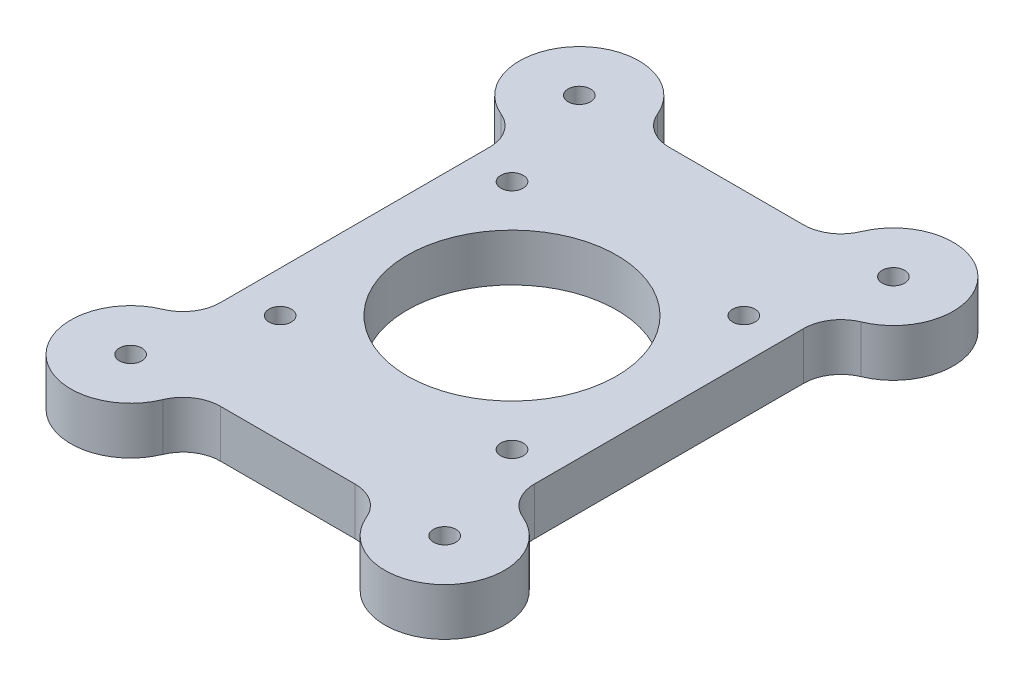
ISO-10303-21;
HEADER;
FILE_DESCRIPTION(('STEP AP214'),'2;1');
FILE_NAME('part.step','',(''),(''),'','','');
FILE_SCHEMA(('AUTOMOTIVE_DESIGN { 1 0 10303 214 1 1 1 1 }'));
ENDSEC;
DATA;
#1=APPLICATION_CONTEXT('core data for automotive mechanical design processes');
#2=APPLICATION_PROTOCOL_DEFINITION('international standard','automotive_design',2000,#1);
#3=PRODUCT_CONTEXT('',#1,'mechanical');
#4=PRODUCT('Part','Part','',(#3));
#5=PRODUCT_RELATED_PRODUCT_CATEGORY('part','',(#4));
#6=PRODUCT_DEFINITION_FORMATION('','',#4);
#7=PRODUCT_DEFINITION_CONTEXT('part definition',#1,'design');
#8=PRODUCT_DEFINITION('design','',#6,#7);
#9=PRODUCT_DEFINITION_SHAPE('','',#8);
#10=(LENGTH_UNIT() NAMED_UNIT(*) SI_UNIT(.MILLI.,.METRE.));
#11=(NAMED_UNIT(*) PLANE_ANGLE_UNIT() SI_UNIT($,.RADIAN.));
#12=(NAMED_UNIT(*) SI_UNIT($,.STERADIAN.) SOLID_ANGLE_UNIT());
#13=UNCERTAINTY_MEASURE_WITH_UNIT(LENGTH_MEASURE(1.E-05),#10,'distance_accuracy_value','');
#14=(GEOMETRIC_REPRESENTATION_CONTEXT(3) GLOBAL_UNCERTAINTY_ASSIGNED_CONTEXT((#13)) GLOBAL_UNIT_ASSIGNED_CONTEXT((#10,
#11,#12)) REPRESENTATION_CONTEXT('',''));
#15=CARTESIAN_POINT('',(0.,0.,0.));
#16=DIRECTION('',(0.,0.,1.));
#17=DIRECTION('',(1.,0.,0.));
#18=AXIS2_PLACEMENT_3D('',#15,#16,#17);
#19=CARTESIAN_POINT('',(21.,6.35,30.));
#20=DIRECTION('',(0.,-1.,0.));
#21=DIRECTION('',(0.,0.,-1.));
#22=AXIS2_PLACEMENT_3D('',#19,#20,#21);
#23=CYLINDRICAL_SURFACE('',#22,8.);
#24=CARTESIAN_POINT('',(21.,0.,30.));
#25=DIRECTION('',(0.,1.,0.));
#26=DIRECTION('',(0.,0.,1.));
#27=AXIS2_PLACEMENT_3D('',#24,#25,#26);
#28=CIRCLE('',#27,8.);
#29=CARTESIAN_POINT('',(13.6153846153846,0.,33.0769230769231));
#30=VERTEX_POINT('',#29);
#31=CARTESIAN_POINT('',(24.0769230769231,0.,22.6153846153846));
#32=VERTEX_POINT('',#31);
#33=EDGE_CURVE('E185',#30,#32,#28,.T.);
#34=ORIENTED_EDGE('',*,*,#33,.T.);
#35=DIRECTION('',(0.,-1.,0.));
#36=VECTOR('',#35,1.);
#37=CARTESIAN_POINT('',(24.0769230769231,6.35,22.6153846153846));
#38=LINE('',#37,#36);
#39=CARTESIAN_POINT('',(24.0769230769231,6.35,22.6153846153846));
#40=VERTEX_POINT('',#39);
#41=EDGE_CURVE('E160',#32,#40,#38,.F.);
#42=ORIENTED_EDGE('',*,*,#41,.T.);
#43=CARTESIAN_POINT('',(21.,6.35,30.));
#44=DIRECTION('',(0.,1.,0.));
#45=DIRECTION('',(0.,0.,1.));
#46=AXIS2_PLACEMENT_3D('',#43,#44,#45);
#47=CIRCLE('',#46,8.);
#48=CARTESIAN_POINT('',(13.6153846153846,6.35,33.0769230769231));
#49=VERTEX_POINT('',#48);
#50=EDGE_CURVE('E215',#49,#40,#47,.T.);
#51=ORIENTED_EDGE('',*,*,#50,.F.);
#52=DIRECTION('',(0.,-1.,0.));
#53=VECTOR('',#52,1.);
#54=CARTESIAN_POINT('',(13.6153846153846,6.35,33.0769230769231));
#55=LINE('',#54,#53);
#56=EDGE_CURVE('E177',#49,#30,#55,.T.);
#57=ORIENTED_EDGE('',*,*,#56,.T.);
#58=EDGE_LOOP('',(#34,#42,#51,#57));
#59=FACE_BOUND('',#58,.T.);
#60=ADVANCED_FACE('F41',(#59),#23,.T.);
#61=CARTESIAN_POINT('',(21.,6.35,0.));
#62=DIRECTION('',(-1.,0.,0.));
#63=DIRECTION('',(0.,0.,1.));
#64=AXIS2_PLACEMENT_3D('',#61,#62,#63);
#65=PLANE('',#64);
#66=DIRECTION('',(0.,0.,-1.));
#67=VECTOR('',#66,1.);
#68=CARTESIAN_POINT('',(21.,6.35,0.));
#69=LINE('',#68,#67);
#70=CARTESIAN_POINT('',(21.,6.35,18.));
#71=VERTEX_POINT('',#70);
#72=CARTESIAN_POINT('',(21.,6.35,-18.));
#73=VERTEX_POINT('',#72);
#74=EDGE_CURVE('E175',#71,#73,#69,.T.);
#75=ORIENTED_EDGE('',*,*,#74,.F.);
#76=DIRECTION('',(0.,1.,0.));
#77=VECTOR('',#76,1.);
#78=CARTESIAN_POINT('',(21.,0.,18.));
#79=LINE('',#78,#77);
#80=CARTESIAN_POINT('',(21.,0.,18.));
#81=VERTEX_POINT('',#80);
#82=EDGE_CURVE('E159',#71,#81,#79,.F.);
#83=ORIENTED_EDGE('',*,*,#82,.T.);
#84=DIRECTION('',(0.,0.,-1.));
#85=VECTOR('',#84,1.);
#86=CARTESIAN_POINT('',(21.,0.,0.));
#87=LINE('',#86,#85);
#88=CARTESIAN_POINT('',(21.,0.,-18.));
#89=VERTEX_POINT('',#88);
#90=EDGE_CURVE('E172',#81,#89,#87,.T.);
#91=ORIENTED_EDGE('',*,*,#90,.T.);
#92=DIRECTION('',(0.,1.,0.));
#93=VECTOR('',#92,1.);
#94=CARTESIAN_POINT('',(21.,6.35,-18.));
#95=LINE('',#94,#93);
#96=EDGE_CURVE('E178',#89,#73,#95,.T.);
#97=ORIENTED_EDGE('',*,*,#96,.T.);
#98=EDGE_LOOP('',(#75,#83,#91,#97));
#99=FACE_BOUND('',#98,.T.);
#100=ADVANCED_FACE('F171',(#99),#65,.F.);
#101=CARTESIAN_POINT('',(21.,6.35,-30.));
#102=DIRECTION('',(0.,-1.,0.));
#103=DIRECTION('',(0.,0.,-1.));
#104=AXIS2_PLACEMENT_3D('',#101,#102,#103);
#105=CYLINDRICAL_SURFACE('',#104,8.);
#106=CARTESIAN_POINT('',(21.,6.35,-30.));
#107=DIRECTION('',(0.,1.,0.));
#108=DIRECTION('',(0.,0.,1.));
#109=AXIS2_PLACEMENT_3D('',#106,#107,#108);
#110=CIRCLE('',#109,8.);
#111=CARTESIAN_POINT('',(24.0769230769231,6.35,-22.6153846153846));
#112=VERTEX_POINT('',#111);
#113=CARTESIAN_POINT('',(13.6153846153846,6.35,-33.0769230769231));
#114=VERTEX_POINT('',#113);
#115=EDGE_CURVE('E329',#112,#114,#110,.T.);
#116=ORIENTED_EDGE('',*,*,#115,.F.);
#117=DIRECTION('',(0.,-1.,0.));
#118=VECTOR('',#117,1.);
#119=CARTESIAN_POINT('',(24.0769230769231,6.35,-22.6153846153846));
#120=LINE('',#119,#118);
#121=CARTESIAN_POINT('',(24.0769230769231,0.,-22.6153846153846));
#122=VERTEX_POINT('',#121);
#123=EDGE_CURVE('E227',#112,#122,#120,.T.);
#124=ORIENTED_EDGE('',*,*,#123,.T.);
#125=CARTESIAN_POINT('',(21.,0.,-30.));
#126=DIRECTION('',(0.,1.,0.));
#127=DIRECTION('',(0.,0.,1.));
#128=AXIS2_PLACEMENT_3D('',#125,#126,#127);
#129=CIRCLE('',#128,8.);
#130=CARTESIAN_POINT('',(13.6153846153846,0.,-33.0769230769231));
#131=VERTEX_POINT('',#130);
#132=EDGE_CURVE('E184',#122,#131,#129,.T.);
#133=ORIENTED_EDGE('',*,*,#132,.T.);
#134=DIRECTION('',(0.,-1.,0.));
#135=VECTOR('',#134,1.);
#136=CARTESIAN_POINT('',(13.6153846153846,6.35,-33.0769230769231));
#137=LINE('',#136,#135);
#138=EDGE_CURVE('E224',#131,#114,#137,.F.);
#139=ORIENTED_EDGE('',*,*,#138,.T.);
#140=EDGE_LOOP('',(#116,#124,#133,#139));
#141=FACE_BOUND('',#140,.T.);
#142=ADVANCED_FACE('F459',(#141),#105,.T.);
#143=CARTESIAN_POINT('',(0.,6.35,-30.));
#144=DIRECTION('',(0.,0.,1.));
#145=DIRECTION('',(1.,0.,0.));
#146=AXIS2_PLACEMENT_3D('',#143,#144,#145);
#147=PLANE('',#146);
#148=DIRECTION('',(-1.,0.,0.));
#149=VECTOR('',#148,1.);
#150=CARTESIAN_POINT('',(0.,0.,-30.));
#151=LINE('',#150,#149);
#152=CARTESIAN_POINT('',(9.00000000000001,0.,-30.));
#153=VERTEX_POINT('',#152);
#154=CARTESIAN_POINT('',(-9.,0.,-30.));
#155=VERTEX_POINT('',#154);
#156=EDGE_CURVE('E190',#153,#155,#151,.T.);
#157=ORIENTED_EDGE('',*,*,#156,.T.);
#158=DIRECTION('',(0.,1.,0.));
#159=VECTOR('',#158,1.);
#160=CARTESIAN_POINT('',(-9.,6.35,-30.));
#161=LINE('',#160,#159);
#162=CARTESIAN_POINT('',(-9.,6.35,-30.));
#163=VERTEX_POINT('',#162);
#164=EDGE_CURVE('E242',#155,#163,#161,.T.);
#165=ORIENTED_EDGE('',*,*,#164,.T.);
#166=DIRECTION('',(-1.,0.,0.));
#167=VECTOR('',#166,1.);
#168=CARTESIAN_POINT('',(0.,6.35,-30.));
#169=LINE('',#168,#167);
#170=CARTESIAN_POINT('',(9.00000000000001,6.35,-30.));
#171=VERTEX_POINT('',#170);
#172=EDGE_CURVE('E325',#171,#163,#169,.T.);
#173=ORIENTED_EDGE('',*,*,#172,.F.);
#174=DIRECTION('',(0.,1.,0.));
#175=VECTOR('',#174,1.);
#176=CARTESIAN_POINT('',(9.00000000000001,0.,-30.));
#177=LINE('',#176,#175);
#178=EDGE_CURVE('E238',#171,#153,#177,.F.);
#179=ORIENTED_EDGE('',*,*,#178,.T.);
#180=EDGE_LOOP('',(#157,#165,#173,#179));
#181=FACE_BOUND('',#180,.T.);
#182=ADVANCED_FACE('F503',(#181),#147,.F.);
#183=CARTESIAN_POINT('',(-21.,6.35,-30.));
#184=DIRECTION('',(0.,-1.,0.));
#185=DIRECTION('',(0.,0.,-1.));
#186=AXIS2_PLACEMENT_3D('',#183,#184,#185);
#187=CYLINDRICAL_SURFACE('',#186,8.);
#188=CARTESIAN_POINT('',(-21.,6.35,-30.));
#189=DIRECTION('',(0.,1.,0.));
#190=DIRECTION('',(0.,0.,1.));
#191=AXIS2_PLACEMENT_3D('',#188,#189,#190);
#192=CIRCLE('',#191,8.);
#193=CARTESIAN_POINT('',(-13.6153846153846,6.35,-33.0769230769231));
#194=VERTEX_POINT('',#193);
#195=CARTESIAN_POINT('',(-24.0769230769231,6.35,-22.6153846153846));
#196=VERTEX_POINT('',#195);
#197=EDGE_CURVE('E321',#194,#196,#192,.T.);
#198=ORIENTED_EDGE('',*,*,#197,.F.);
#199=DIRECTION('',(0.,-1.,0.));
#200=VECTOR('',#199,1.);
#201=CARTESIAN_POINT('',(-13.6153846153846,6.35,-33.0769230769231));
#202=LINE('',#201,#200);
#203=CARTESIAN_POINT('',(-13.6153846153846,0.,-33.0769230769231));
#204=VERTEX_POINT('',#203);
#205=EDGE_CURVE('E234',#194,#204,#202,.T.);
#206=ORIENTED_EDGE('',*,*,#205,.T.);
#207=CARTESIAN_POINT('',(-21.,0.,-30.));
#208=DIRECTION('',(0.,1.,0.));
#209=DIRECTION('',(0.,0.,1.));
#210=AXIS2_PLACEMENT_3D('',#207,#208,#209);
#211=CIRCLE('',#210,8.);
#212=CARTESIAN_POINT('',(-24.0769230769231,0.,-22.6153846153846));
#213=VERTEX_POINT('',#212);
#214=EDGE_CURVE('E199',#204,#213,#211,.T.);
#215=ORIENTED_EDGE('',*,*,#214,.T.);
#216=DIRECTION('',(0.,-1.,0.));
#217=VECTOR('',#216,1.);
#218=CARTESIAN_POINT('',(-24.0769230769231,6.35,-22.6153846153846));
#219=LINE('',#218,#217);
#220=EDGE_CURVE('E231',#213,#196,#219,.F.);
#221=ORIENTED_EDGE('',*,*,#220,.T.);
#222=EDGE_LOOP('',(#198,#206,#215,#221));
#223=FACE_BOUND('',#222,.T.);
#224=ADVANCED_FACE('F510',(#223),#187,.T.);
#225=CARTESIAN_POINT('',(-21.,6.35,0.));
#226=DIRECTION('',(-1.,0.,0.));
#227=DIRECTION('',(0.,0.,1.));
#228=AXIS2_PLACEMENT_3D('',#225,#226,#227);
#229=PLANE('',#228);
#230=DIRECTION('',(0.,0.,-1.));
#231=VECTOR('',#230,1.);
#232=CARTESIAN_POINT('',(-21.,6.35,0.));
#233=LINE('',#232,#231);
#234=CARTESIAN_POINT('',(-21.,6.35,18.));
#235=VERTEX_POINT('',#234);
#236=CARTESIAN_POINT('',(-21.,6.35,-18.));
#237=VERTEX_POINT('',#236);
#238=EDGE_CURVE('E315',#235,#237,#233,.T.);
#239=ORIENTED_EDGE('',*,*,#238,.T.);
#240=DIRECTION('',(0.,-1.,0.));
#241=VECTOR('',#240,1.);
#242=CARTESIAN_POINT('',(-21.,6.35,-18.));
#243=LINE('',#242,#241);
#244=CARTESIAN_POINT('',(-21.,0.,-18.));
#245=VERTEX_POINT('',#244);
#246=EDGE_CURVE('E248',#237,#245,#243,.T.);
#247=ORIENTED_EDGE('',*,*,#246,.T.);
#248=DIRECTION('',(0.,0.,-1.));
#249=VECTOR('',#248,1.);
#250=CARTESIAN_POINT('',(-21.,0.,0.));
#251=LINE('',#250,#249);
#252=CARTESIAN_POINT('',(-21.,0.,18.));
#253=VERTEX_POINT('',#252);
#254=EDGE_CURVE('E203',#253,#245,#251,.T.);
#255=ORIENTED_EDGE('',*,*,#254,.F.);
#256=DIRECTION('',(0.,-1.,0.));
#257=VECTOR('',#256,1.);
#258=CARTESIAN_POINT('',(-21.,6.35,18.));
#259=LINE('',#258,#257);
#260=EDGE_CURVE('E245',#253,#235,#259,.F.);
#261=ORIENTED_EDGE('',*,*,#260,.T.);
#262=EDGE_LOOP('',(#239,#247,#255,#261));
#263=FACE_BOUND('',#262,.T.);
#264=ADVANCED_FACE('F516',(#263),#229,.T.);
#265=CARTESIAN_POINT('',(-21.,6.35,30.));
#266=DIRECTION('',(0.,-1.,0.));
#267=DIRECTION('',(0.,0.,-1.));
#268=AXIS2_PLACEMENT_3D('',#265,#266,#267);
#269=CYLINDRICAL_SURFACE('',#268,8.);
#270=CARTESIAN_POINT('',(-21.,6.35,30.));
#271=DIRECTION('',(0.,1.,0.));
#272=DIRECTION('',(0.,0.,1.));
#273=AXIS2_PLACEMENT_3D('',#270,#271,#272);
#274=CIRCLE('',#273,8.);
#275=CARTESIAN_POINT('',(-24.0769230769231,6.35,22.6153846153846));
#276=VERTEX_POINT('',#275);
#277=CARTESIAN_POINT('',(-13.6153846153846,6.35,33.0769230769231));
#278=VERTEX_POINT('',#277);
#279=EDGE_CURVE('E313',#276,#278,#274,.T.);
#280=ORIENTED_EDGE('',*,*,#279,.F.);
#281=DIRECTION('',(0.,-1.,0.));
#282=VECTOR('',#281,1.);
#283=CARTESIAN_POINT('',(-24.0769230769231,6.35,22.6153846153846));
#284=LINE('',#283,#282);
#285=CARTESIAN_POINT('',(-24.0769230769231,0.,22.6153846153846));
#286=VERTEX_POINT('',#285);
#287=EDGE_CURVE('E255',#276,#286,#284,.T.);
#288=ORIENTED_EDGE('',*,*,#287,.T.);
#289=CARTESIAN_POINT('',(-21.,0.,30.));
#290=DIRECTION('',(0.,1.,0.));
#291=DIRECTION('',(0.,0.,1.));
#292=AXIS2_PLACEMENT_3D('',#289,#290,#291);
#293=CIRCLE('',#292,8.);
#294=CARTESIAN_POINT('',(-13.6153846153846,0.,33.0769230769231));
#295=VERTEX_POINT('',#294);
#296=EDGE_CURVE('E207',#286,#295,#293,.T.);
#297=ORIENTED_EDGE('',*,*,#296,.T.);
#298=DIRECTION('',(0.,-1.,0.));
#299=VECTOR('',#298,1.);
#300=CARTESIAN_POINT('',(-13.6153846153846,6.35,33.0769230769231));
#301=LINE('',#300,#299);
#302=EDGE_CURVE('E252',#295,#278,#301,.F.);
#303=ORIENTED_EDGE('',*,*,#302,.T.);
#304=EDGE_LOOP('',(#280,#288,#297,#303));
#305=FACE_BOUND('',#304,.T.);
#306=ADVANCED_FACE('F308',(#305),#269,.T.);
#307=CARTESIAN_POINT('',(0.,6.35,30.));
#308=DIRECTION('',(0.,0.,1.));
#309=DIRECTION('',(1.,0.,0.));
#310=AXIS2_PLACEMENT_3D('',#307,#308,#309);
#311=PLANE('',#310);
#312=DIRECTION('',(-1.,0.,0.));
#313=VECTOR('',#312,1.);
#314=CARTESIAN_POINT('',(0.,0.,30.));
#315=LINE('',#314,#313);
#316=CARTESIAN_POINT('',(9.,0.,30.));
#317=VERTEX_POINT('',#316);
#318=CARTESIAN_POINT('',(-9.,0.,30.));
#319=VERTEX_POINT('',#318);
#320=EDGE_CURVE('E211',#317,#319,#315,.T.);
#321=ORIENTED_EDGE('',*,*,#320,.F.);
#322=DIRECTION('',(0.,-1.,0.));
#323=VECTOR('',#322,1.);
#324=CARTESIAN_POINT('',(9.,6.35,30.));
#325=LINE('',#324,#323);
#326=CARTESIAN_POINT('',(9.,6.35,30.));
#327=VERTEX_POINT('',#326);
#328=EDGE_CURVE('E62',#317,#327,#325,.F.);
#329=ORIENTED_EDGE('',*,*,#328,.T.);
#330=DIRECTION('',(-1.,0.,0.));
#331=VECTOR('',#330,1.);
#332=CARTESIAN_POINT('',(0.,6.35,30.));
#333=LINE('',#332,#331);
#334=CARTESIAN_POINT('',(-9.,6.35,30.));
#335=VERTEX_POINT('',#334);
#336=EDGE_CURVE('E217',#327,#335,#333,.T.);
#337=ORIENTED_EDGE('',*,*,#336,.T.);
#338=DIRECTION('',(0.,-1.,0.));
#339=VECTOR('',#338,1.);
#340=CARTESIAN_POINT('',(-9.,6.35,30.));
#341=LINE('',#340,#339);
#342=EDGE_CURVE('E259',#335,#319,#341,.T.);
#343=ORIENTED_EDGE('',*,*,#342,.T.);
#344=EDGE_LOOP('',(#321,#329,#337,#343));
#345=FACE_BOUND('',#344,.T.);
#346=ADVANCED_FACE('F310',(#345),#311,.T.);
#347=CARTESIAN_POINT('',(0.,6.35,0.));
#348=DIRECTION('',(0.,1.,0.));
#349=DIRECTION('',(0.,0.,1.));
#350=AXIS2_PLACEMENT_3D('',#347,#348,#349);
#351=PLANE('',#350);
#352=CARTESIAN_POINT('',(-21.,6.35,30.));
#353=DIRECTION('',(0.,1.,0.));
#354=DIRECTION('',(0.,0.,1.));
#355=AXIS2_PLACEMENT_3D('',#352,#353,#354);
#356=CIRCLE('',#355,1.5);
#357=CARTESIAN_POINT('',(-21.,6.35,31.5));
#358=VERTEX_POINT('',#357);
#359=EDGE_CURVE('E386',#358,#358,#356,.T.);
#360=ORIENTED_EDGE('',*,*,#359,.F.);
#361=EDGE_LOOP('',(#360));
#362=FACE_BOUND('',#361,.T.);
#363=CARTESIAN_POINT('',(21.,6.35,30.));
#364=DIRECTION('',(0.,1.,0.));
#365=DIRECTION('',(0.,0.,1.));
#366=AXIS2_PLACEMENT_3D('',#363,#364,#365);
#367=CIRCLE('',#366,1.5);
#368=CARTESIAN_POINT('',(21.,6.35,31.5));
#369=VERTEX_POINT('',#368);
#370=EDGE_CURVE('E394',#369,#369,#367,.T.);
#371=ORIENTED_EDGE('',*,*,#370,.F.);
#372=EDGE_LOOP('',(#371));
#373=FACE_BOUND('',#372,.T.);
#374=CARTESIAN_POINT('',(21.,6.35,-30.));
#375=DIRECTION('',(0.,1.,0.));
#376=DIRECTION('',(0.,0.,1.));
#377=AXIS2_PLACEMENT_3D('',#374,#375,#376);
#378=CIRCLE('',#377,1.5);
#379=CARTESIAN_POINT('',(21.,6.35,-28.5));
#380=VERTEX_POINT('',#379);
#381=EDGE_CURVE('E402',#380,#380,#378,.T.);
#382=ORIENTED_EDGE('',*,*,#381,.F.);
#383=EDGE_LOOP('',(#382));
#384=FACE_BOUND('',#383,.T.);
#385=CARTESIAN_POINT('',(-21.,6.35,-30.));
#386=DIRECTION('',(0.,1.,0.));
#387=DIRECTION('',(0.,0.,1.));
#388=AXIS2_PLACEMENT_3D('',#385,#386,#387);
#389=CIRCLE('',#388,1.5);
#390=CARTESIAN_POINT('',(-21.,6.35,-28.5));
#391=VERTEX_POINT('',#390);
#392=EDGE_CURVE('E378',#391,#391,#389,.T.);
#393=ORIENTED_EDGE('',*,*,#392,.F.);
#394=EDGE_LOOP('',(#393));
#395=FACE_BOUND('',#394,.T.);
#396=CARTESIAN_POINT('',(15.5,6.35,15.5));
#397=DIRECTION('',(0.,1.,0.));
#398=DIRECTION('',(0.,0.,1.));
#399=AXIS2_PLACEMENT_3D('',#396,#397,#398);
#400=CIRCLE('',#399,1.5);
#401=CARTESIAN_POINT('',(15.5,6.35,17.));
#402=VERTEX_POINT('',#401);
#403=EDGE_CURVE('E355',#402,#402,#400,.T.);
#404=ORIENTED_EDGE('',*,*,#403,.F.);
#405=EDGE_LOOP('',(#404));
#406=FACE_BOUND('',#405,.T.);
#407=CARTESIAN_POINT('',(15.5,6.35,-15.5));
#408=DIRECTION('',(0.,1.,0.));
#409=DIRECTION('',(0.,0.,1.));
#410=AXIS2_PLACEMENT_3D('',#407,#408,#409);
#411=CIRCLE('',#410,1.49999999999999);
#412=CARTESIAN_POINT('',(15.5,6.35,-14.));
#413=VERTEX_POINT('',#412);
#414=EDGE_CURVE('E346',#413,#413,#411,.T.);
#415=ORIENTED_EDGE('',*,*,#414,.F.);
#416=EDGE_LOOP('',(#415));
#417=FACE_BOUND('',#416,.T.);
#418=CARTESIAN_POINT('',(0.,6.35,0.));
#419=DIRECTION('',(0.,1.,0.));
#420=DIRECTION('',(0.,0.,1.));
#421=AXIS2_PLACEMENT_3D('',#418,#419,#420);
#422=CIRCLE('',#421,14.);
#423=CARTESIAN_POINT('',(0.,6.35,14.));
#424=VERTEX_POINT('',#423);
#425=EDGE_CURVE('E370',#424,#424,#422,.T.);
#426=ORIENTED_EDGE('',*,*,#425,.F.);
#427=EDGE_LOOP('',(#426));
#428=FACE_BOUND('',#427,.T.);
#429=CARTESIAN_POINT('',(-15.5,6.35,-15.5));
#430=DIRECTION('',(0.,1.,0.));
#431=DIRECTION('',(0.,0.,1.));
#432=AXIS2_PLACEMENT_3D('',#429,#430,#431);
#433=CIRCLE('',#432,1.5);
#434=CARTESIAN_POINT('',(-15.5,6.35,-14.));
#435=VERTEX_POINT('',#434);
#436=EDGE_CURVE('E362',#435,#435,#433,.T.);
#437=ORIENTED_EDGE('',*,*,#436,.F.);
#438=EDGE_LOOP('',(#437));
#439=FACE_BOUND('',#438,.T.);
#440=CARTESIAN_POINT('',(-15.5,6.35,15.5));
#441=DIRECTION('',(0.,1.,0.));
#442=DIRECTION('',(0.,0.,1.));
#443=AXIS2_PLACEMENT_3D('',#440,#441,#442);
#444=CIRCLE('',#443,1.5);
#445=CARTESIAN_POINT('',(-15.5,6.35,17.));
#446=VERTEX_POINT('',#445);
#447=EDGE_CURVE('E338',#446,#446,#444,.T.);
#448=ORIENTED_EDGE('',*,*,#447,.F.);
#449=EDGE_LOOP('',(#448));
#450=FACE_BOUND('',#449,.T.);
#451=ORIENTED_EDGE('',*,*,#336,.F.);
#452=CARTESIAN_POINT('',(9.,6.35,35.));
#453=DIRECTION('',(0.,1.,0.));
#454=DIRECTION('',(0.,0.,1.));
#455=AXIS2_PLACEMENT_3D('',#452,#453,#454);
#456=CIRCLE('',#455,5.);
#457=EDGE_CURVE('E299',#327,#49,#456,.F.);
#458=ORIENTED_EDGE('',*,*,#457,.T.);
#459=ORIENTED_EDGE('',*,*,#50,.T.);
#460=CARTESIAN_POINT('',(26.,6.35,18.));
#461=DIRECTION('',(0.,1.,0.));
#462=DIRECTION('',(0.,0.,1.));
#463=AXIS2_PLACEMENT_3D('',#460,#461,#462);
#464=CIRCLE('',#463,5.);
#465=EDGE_CURVE('E166',#40,#71,#464,.F.);
#466=ORIENTED_EDGE('',*,*,#465,.T.);
#467=ORIENTED_EDGE('',*,*,#74,.T.);
#468=CARTESIAN_POINT('',(26.,6.35,-18.));
#469=DIRECTION('',(0.,1.,0.));
#470=DIRECTION('',(0.,0.,1.));
#471=AXIS2_PLACEMENT_3D('',#468,#469,#470);
#472=CIRCLE('',#471,5.);
#473=EDGE_CURVE('E269',#73,#112,#472,.F.);
#474=ORIENTED_EDGE('',*,*,#473,.T.);
#475=ORIENTED_EDGE('',*,*,#115,.T.);
#476=CARTESIAN_POINT('',(9.00000000000001,6.35,-35.));
#477=DIRECTION('',(0.,1.,0.));
#478=DIRECTION('',(0.,0.,1.));
#479=AXIS2_PLACEMENT_3D('',#476,#477,#478);
#480=CIRCLE('',#479,5.);
#481=EDGE_CURVE('E281',#114,#171,#480,.F.);
#482=ORIENTED_EDGE('',*,*,#481,.T.);
#483=ORIENTED_EDGE('',*,*,#172,.T.);
#484=CARTESIAN_POINT('',(-9.,6.35,-35.));
#485=DIRECTION('',(0.,1.,0.));
#486=DIRECTION('',(0.,0.,1.));
#487=AXIS2_PLACEMENT_3D('',#484,#485,#486);
#488=CIRCLE('',#487,5.);
#489=EDGE_CURVE('E275',#163,#194,#488,.F.);
#490=ORIENTED_EDGE('',*,*,#489,.T.);
#491=ORIENTED_EDGE('',*,*,#197,.T.);
#492=CARTESIAN_POINT('',(-26.,6.35,-18.));
#493=DIRECTION('',(0.,1.,0.));
#494=DIRECTION('',(0.,0.,1.));
#495=AXIS2_PLACEMENT_3D('',#492,#493,#494);
#496=CIRCLE('',#495,5.);
#497=EDGE_CURVE('E287',#196,#237,#496,.F.);
#498=ORIENTED_EDGE('',*,*,#497,.T.);
#499=ORIENTED_EDGE('',*,*,#238,.F.);
#500=CARTESIAN_POINT('',(-26.,6.35,18.));
#501=DIRECTION('',(0.,1.,0.));
#502=DIRECTION('',(0.,0.,1.));
#503=AXIS2_PLACEMENT_3D('',#500,#501,#502);
#504=CIRCLE('',#503,5.);
#505=EDGE_CURVE('E293',#235,#276,#504,.F.);
#506=ORIENTED_EDGE('',*,*,#505,.T.);
#507=ORIENTED_EDGE('',*,*,#279,.T.);
#508=CARTESIAN_POINT('',(-9.,6.35,35.));
#509=DIRECTION('',(0.,1.,0.));
#510=DIRECTION('',(0.,0.,1.));
#511=AXIS2_PLACEMENT_3D('',#508,#509,#510);
#512=CIRCLE('',#511,5.);
#513=EDGE_CURVE('E11',#278,#335,#512,.F.);
#514=ORIENTED_EDGE('',*,*,#513,.T.);
#515=EDGE_LOOP('',(#451,#458,#459,#466,#467,#474,#475,#482,#483,#490,#491,#498,#499,#506,#507,#514));
#516=FACE_BOUND('',#515,.T.);
#517=ADVANCED_FACE('F420',(#362,#373,#384,#395,#406,#417,#428,#439,#450,#516),#351,.T.);
#518=CARTESIAN_POINT('',(0.,0.,0.));
#519=DIRECTION('',(0.,1.,0.));
#520=DIRECTION('',(0.,0.,1.));
#521=AXIS2_PLACEMENT_3D('',#518,#519,#520);
#522=PLANE('',#521);
#523=CARTESIAN_POINT('',(-21.,0.,30.));
#524=DIRECTION('',(0.,1.,0.));
#525=DIRECTION('',(0.,0.,1.));
#526=AXIS2_PLACEMENT_3D('',#523,#524,#525);
#527=CIRCLE('',#526,1.5);
#528=CARTESIAN_POINT('',(-21.,0.,31.5));
#529=VERTEX_POINT('',#528);
#530=EDGE_CURVE('E390',#529,#529,#527,.T.);
#531=ORIENTED_EDGE('',*,*,#530,.T.);
#532=EDGE_LOOP('',(#531));
#533=FACE_BOUND('',#532,.T.);
#534=CARTESIAN_POINT('',(21.,0.,30.));
#535=DIRECTION('',(0.,1.,0.));
#536=DIRECTION('',(0.,0.,1.));
#537=AXIS2_PLACEMENT_3D('',#534,#535,#536);
#538=CIRCLE('',#537,1.5);
#539=CARTESIAN_POINT('',(21.,0.,31.5));
#540=VERTEX_POINT('',#539);
#541=EDGE_CURVE('E398',#540,#540,#538,.T.);
#542=ORIENTED_EDGE('',*,*,#541,.T.);
#543=EDGE_LOOP('',(#542));
#544=FACE_BOUND('',#543,.T.);
#545=CARTESIAN_POINT('',(21.,0.,-30.));
#546=DIRECTION('',(0.,1.,0.));
#547=DIRECTION('',(0.,0.,1.));
#548=AXIS2_PLACEMENT_3D('',#545,#546,#547);
#549=CIRCLE('',#548,1.5);
#550=CARTESIAN_POINT('',(21.,0.,-28.5));
#551=VERTEX_POINT('',#550);
#552=EDGE_CURVE('E382',#551,#551,#549,.T.);
#553=ORIENTED_EDGE('',*,*,#552,.T.);
#554=EDGE_LOOP('',(#553));
#555=FACE_BOUND('',#554,.T.);
#556=CARTESIAN_POINT('',(-21.,0.,-30.));
#557=DIRECTION('',(0.,1.,0.));
#558=DIRECTION('',(0.,0.,1.));
#559=AXIS2_PLACEMENT_3D('',#556,#557,#558);
#560=CIRCLE('',#559,1.5);
#561=CARTESIAN_POINT('',(-21.,0.,-28.5));
#562=VERTEX_POINT('',#561);
#563=EDGE_CURVE('E374',#562,#562,#560,.T.);
#564=ORIENTED_EDGE('',*,*,#563,.T.);
#565=EDGE_LOOP('',(#564));
#566=FACE_BOUND('',#565,.T.);
#567=CARTESIAN_POINT('',(15.5,0.,15.5));
#568=DIRECTION('',(0.,1.,0.));
#569=DIRECTION('',(0.,0.,1.));
#570=AXIS2_PLACEMENT_3D('',#567,#568,#569);
#571=CIRCLE('',#570,1.5);
#572=CARTESIAN_POINT('',(15.5,0.,17.));
#573=VERTEX_POINT('',#572);
#574=EDGE_CURVE('E342',#573,#573,#571,.T.);
#575=ORIENTED_EDGE('',*,*,#574,.T.);
#576=EDGE_LOOP('',(#575));
#577=FACE_BOUND('',#576,.T.);
#578=CARTESIAN_POINT('',(15.5,0.,-15.5));
#579=DIRECTION('',(0.,1.,0.));
#580=DIRECTION('',(0.,0.,1.));
#581=AXIS2_PLACEMENT_3D('',#578,#579,#580);
#582=CIRCLE('',#581,1.49999999999999);
#583=CARTESIAN_POINT('',(15.5,0.,-14.));
#584=VERTEX_POINT('',#583);
#585=EDGE_CURVE('E350',#584,#584,#582,.T.);
#586=ORIENTED_EDGE('',*,*,#585,.T.);
#587=EDGE_LOOP('',(#586));
#588=FACE_BOUND('',#587,.T.);
#589=CARTESIAN_POINT('',(0.,0.,0.));
#590=DIRECTION('',(0.,1.,0.));
#591=DIRECTION('',(0.,0.,1.));
#592=AXIS2_PLACEMENT_3D('',#589,#590,#591);
#593=CIRCLE('',#592,14.);
#594=CARTESIAN_POINT('',(0.,0.,14.));
#595=VERTEX_POINT('',#594);
#596=EDGE_CURVE('E366',#595,#595,#593,.T.);
#597=ORIENTED_EDGE('',*,*,#596,.T.);
#598=EDGE_LOOP('',(#597));
#599=FACE_BOUND('',#598,.T.);
#600=CARTESIAN_POINT('',(-15.5,0.,-15.5));
#601=DIRECTION('',(0.,1.,0.));
#602=DIRECTION('',(0.,0.,1.));
#603=AXIS2_PLACEMENT_3D('',#600,#601,#602);
#604=CIRCLE('',#603,1.5);
#605=CARTESIAN_POINT('',(-15.5,0.,-14.));
#606=VERTEX_POINT('',#605);
#607=EDGE_CURVE('E351',#606,#606,#604,.T.);
#608=ORIENTED_EDGE('',*,*,#607,.T.);
#609=EDGE_LOOP('',(#608));
#610=FACE_BOUND('',#609,.T.);
#611=CARTESIAN_POINT('',(-15.5,0.,15.5));
#612=DIRECTION('',(0.,1.,0.));
#613=DIRECTION('',(0.,0.,1.));
#614=AXIS2_PLACEMENT_3D('',#611,#612,#613);
#615=CIRCLE('',#614,1.5);
#616=CARTESIAN_POINT('',(-15.5,0.,17.));
#617=VERTEX_POINT('',#616);
#618=EDGE_CURVE('E192',#617,#617,#615,.T.);
#619=ORIENTED_EDGE('',*,*,#618,.T.);
#620=EDGE_LOOP('',(#619));
#621=FACE_BOUND('',#620,.T.);
#622=ORIENTED_EDGE('',*,*,#33,.F.);
#623=CARTESIAN_POINT('',(9.,0.,35.));
#624=DIRECTION('',(0.,1.,0.));
#625=DIRECTION('',(0.,0.,1.));
#626=AXIS2_PLACEMENT_3D('',#623,#624,#625);
#627=CIRCLE('',#626,5.);
#628=EDGE_CURVE('E296',#30,#317,#627,.T.);
#629=ORIENTED_EDGE('',*,*,#628,.T.);
#630=ORIENTED_EDGE('',*,*,#320,.T.);
#631=CARTESIAN_POINT('',(-9.,0.,35.));
#632=DIRECTION('',(0.,1.,0.));
#633=DIRECTION('',(0.,0.,1.));
#634=AXIS2_PLACEMENT_3D('',#631,#632,#633);
#635=CIRCLE('',#634,5.);
#636=EDGE_CURVE('E50',#319,#295,#635,.T.);
#637=ORIENTED_EDGE('',*,*,#636,.T.);
#638=ORIENTED_EDGE('',*,*,#296,.F.);
#639=CARTESIAN_POINT('',(-26.,0.,18.));
#640=DIRECTION('',(0.,1.,0.));
#641=DIRECTION('',(0.,0.,1.));
#642=AXIS2_PLACEMENT_3D('',#639,#640,#641);
#643=CIRCLE('',#642,5.);
#644=EDGE_CURVE('E290',#286,#253,#643,.T.);
#645=ORIENTED_EDGE('',*,*,#644,.T.);
#646=ORIENTED_EDGE('',*,*,#254,.T.);
#647=CARTESIAN_POINT('',(-26.,0.,-18.));
#648=DIRECTION('',(0.,1.,0.));
#649=DIRECTION('',(0.,0.,1.));
#650=AXIS2_PLACEMENT_3D('',#647,#648,#649);
#651=CIRCLE('',#650,5.);
#652=EDGE_CURVE('E284',#245,#213,#651,.T.);
#653=ORIENTED_EDGE('',*,*,#652,.T.);
#654=ORIENTED_EDGE('',*,*,#214,.F.);
#655=CARTESIAN_POINT('',(-9.,0.,-35.));
#656=DIRECTION('',(0.,1.,0.));
#657=DIRECTION('',(0.,0.,1.));
#658=AXIS2_PLACEMENT_3D('',#655,#656,#657);
#659=CIRCLE('',#658,5.);
#660=EDGE_CURVE('E272',#204,#155,#659,.T.);
#661=ORIENTED_EDGE('',*,*,#660,.T.);
#662=ORIENTED_EDGE('',*,*,#156,.F.);
#663=CARTESIAN_POINT('',(9.00000000000001,0.,-35.));
#664=DIRECTION('',(0.,1.,0.));
#665=DIRECTION('',(0.,0.,1.));
#666=AXIS2_PLACEMENT_3D('',#663,#664,#665);
#667=CIRCLE('',#666,5.);
#668=EDGE_CURVE('E278',#153,#131,#667,.T.);
#669=ORIENTED_EDGE('',*,*,#668,.T.);
#670=ORIENTED_EDGE('',*,*,#132,.F.);
#671=CARTESIAN_POINT('',(26.,0.,-18.));
#672=DIRECTION('',(0.,1.,0.));
#673=DIRECTION('',(0.,0.,1.));
#674=AXIS2_PLACEMENT_3D('',#671,#672,#673);
#675=CIRCLE('',#674,5.);
#676=EDGE_CURVE('E182',#122,#89,#675,.T.);
#677=ORIENTED_EDGE('',*,*,#676,.T.);
#678=ORIENTED_EDGE('',*,*,#90,.F.);
#679=CARTESIAN_POINT('',(26.,0.,18.));
#680=DIRECTION('',(0.,1.,0.));
#681=DIRECTION('',(0.,0.,1.));
#682=AXIS2_PLACEMENT_3D('',#679,#680,#681);
#683=CIRCLE('',#682,5.);
#684=EDGE_CURVE('E155',#81,#32,#683,.T.);
#685=ORIENTED_EDGE('',*,*,#684,.T.);
#686=EDGE_LOOP('',(#622,#629,#630,#637,#638,#645,#646,#653,#654,#661,#662,#669,#670,#677,#678,#685));
#687=FACE_BOUND('',#686,.T.);
#688=ADVANCED_FACE('F180',(#533,#544,#555,#566,#577,#588,#599,#610,#621,#687),#522,.F.);
#689=CARTESIAN_POINT('',(-15.5,0.,15.5));
#690=DIRECTION('',(0.,1.,0.));
#691=DIRECTION('',(0.,0.,1.));
#692=AXIS2_PLACEMENT_3D('',#689,#690,#691);
#693=CYLINDRICAL_SURFACE('',#692,1.5);
#694=ORIENTED_EDGE('',*,*,#618,.F.);
#695=EDGE_LOOP('',(#694));
#696=FACE_BOUND('',#695,.T.);
#697=ORIENTED_EDGE('',*,*,#447,.T.);
#698=EDGE_LOOP('',(#697));
#699=FACE_BOUND('',#698,.T.);
#700=ADVANCED_FACE('F437',(#696,#699),#693,.F.);
#701=CARTESIAN_POINT('',(-15.5,0.,-15.5));
#702=DIRECTION('',(0.,1.,0.));
#703=DIRECTION('',(0.,0.,1.));
#704=AXIS2_PLACEMENT_3D('',#701,#702,#703);
#705=CYLINDRICAL_SURFACE('',#704,1.5);
#706=ORIENTED_EDGE('',*,*,#607,.F.);
#707=EDGE_LOOP('',(#706));
#708=FACE_BOUND('',#707,.T.);
#709=ORIENTED_EDGE('',*,*,#436,.T.);
#710=EDGE_LOOP('',(#709));
#711=FACE_BOUND('',#710,.T.);
#712=ADVANCED_FACE('F439',(#708,#711),#705,.F.);
#713=CARTESIAN_POINT('',(0.,0.,0.));
#714=DIRECTION('',(0.,1.,0.));
#715=DIRECTION('',(0.,0.,1.));
#716=AXIS2_PLACEMENT_3D('',#713,#714,#715);
#717=CYLINDRICAL_SURFACE('',#716,14.);
#718=ORIENTED_EDGE('',*,*,#596,.F.);
#719=EDGE_LOOP('',(#718));
#720=FACE_BOUND('',#719,.T.);
#721=ORIENTED_EDGE('',*,*,#425,.T.);
#722=EDGE_LOOP('',(#721));
#723=FACE_BOUND('',#722,.T.);
#724=ADVANCED_FACE('F446',(#720,#723),#717,.F.);
#725=CARTESIAN_POINT('',(15.5,0.,-15.5));
#726=DIRECTION('',(0.,1.,0.));
#727=DIRECTION('',(0.,0.,1.));
#728=AXIS2_PLACEMENT_3D('',#725,#726,#727);
#729=CYLINDRICAL_SURFACE('',#728,1.49999999999999);
#730=ORIENTED_EDGE('',*,*,#585,.F.);
#731=EDGE_LOOP('',(#730));
#732=FACE_BOUND('',#731,.T.);
#733=ORIENTED_EDGE('',*,*,#414,.T.);
#734=EDGE_LOOP('',(#733));
#735=FACE_BOUND('',#734,.T.);
#736=ADVANCED_FACE('F658',(#732,#735),#729,.F.);
#737=CARTESIAN_POINT('',(15.5,0.,15.5));
#738=DIRECTION('',(0.,1.,0.));
#739=DIRECTION('',(0.,0.,1.));
#740=AXIS2_PLACEMENT_3D('',#737,#738,#739);
#741=CYLINDRICAL_SURFACE('',#740,1.5);
#742=ORIENTED_EDGE('',*,*,#574,.F.);
#743=EDGE_LOOP('',(#742));
#744=FACE_BOUND('',#743,.T.);
#745=ORIENTED_EDGE('',*,*,#403,.T.);
#746=EDGE_LOOP('',(#745));
#747=FACE_BOUND('',#746,.T.);
#748=ADVANCED_FACE('F650',(#744,#747),#741,.F.);
#749=CARTESIAN_POINT('',(-21.,0.,-30.));
#750=DIRECTION('',(0.,1.,0.));
#751=DIRECTION('',(0.,0.,1.));
#752=AXIS2_PLACEMENT_3D('',#749,#750,#751);
#753=CYLINDRICAL_SURFACE('',#752,1.5);
#754=ORIENTED_EDGE('',*,*,#563,.F.);
#755=EDGE_LOOP('',(#754));
#756=FACE_BOUND('',#755,.T.);
#757=ORIENTED_EDGE('',*,*,#392,.T.);
#758=EDGE_LOOP('',(#757));
#759=FACE_BOUND('',#758,.T.);
#760=ADVANCED_FACE('F416',(#756,#759),#753,.F.);
#761=CARTESIAN_POINT('',(21.,0.,-30.));
#762=DIRECTION('',(0.,1.,0.));
#763=DIRECTION('',(0.,0.,1.));
#764=AXIS2_PLACEMENT_3D('',#761,#762,#763);
#765=CYLINDRICAL_SURFACE('',#764,1.5);
#766=ORIENTED_EDGE('',*,*,#552,.F.);
#767=EDGE_LOOP('',(#766));
#768=FACE_BOUND('',#767,.T.);
#769=ORIENTED_EDGE('',*,*,#381,.T.);
#770=EDGE_LOOP('',(#769));
#771=FACE_BOUND('',#770,.T.);
#772=ADVANCED_FACE('F412',(#768,#771),#765,.F.);
#773=CARTESIAN_POINT('',(21.,0.,30.));
#774=DIRECTION('',(0.,1.,0.));
#775=DIRECTION('',(0.,0.,1.));
#776=AXIS2_PLACEMENT_3D('',#773,#774,#775);
#777=CYLINDRICAL_SURFACE('',#776,1.5);
#778=ORIENTED_EDGE('',*,*,#541,.F.);
#779=EDGE_LOOP('',(#778));
#780=FACE_BOUND('',#779,.T.);
#781=ORIENTED_EDGE('',*,*,#370,.T.);
#782=EDGE_LOOP('',(#781));
#783=FACE_BOUND('',#782,.T.);
#784=ADVANCED_FACE('F415',(#780,#783),#777,.F.);
#785=CARTESIAN_POINT('',(-21.,0.,30.));
#786=DIRECTION('',(0.,1.,0.));
#787=DIRECTION('',(0.,0.,1.));
#788=AXIS2_PLACEMENT_3D('',#785,#786,#787);
#789=CYLINDRICAL_SURFACE('',#788,1.5);
#790=ORIENTED_EDGE('',*,*,#530,.F.);
#791=EDGE_LOOP('',(#790));
#792=FACE_BOUND('',#791,.T.);
#793=ORIENTED_EDGE('',*,*,#359,.T.);
#794=EDGE_LOOP('',(#793));
#795=FACE_BOUND('',#794,.T.);
#796=ADVANCED_FACE('F466',(#792,#795),#789,.F.);
#797=CARTESIAN_POINT('',(26.,6.35,18.));
#798=DIRECTION('',(0.,-1.,0.));
#799=DIRECTION('',(0.,0.,-1.));
#800=AXIS2_PLACEMENT_3D('',#797,#798,#799);
#801=CYLINDRICAL_SURFACE('',#800,5.);
#802=ORIENTED_EDGE('',*,*,#465,.F.);
#803=ORIENTED_EDGE('',*,*,#41,.F.);
#804=ORIENTED_EDGE('',*,*,#684,.F.);
#805=ORIENTED_EDGE('',*,*,#82,.F.);
#806=EDGE_LOOP('',(#802,#803,#804,#805));
#807=FACE_BOUND('',#806,.T.);
#808=ADVANCED_FACE('F158',(#807),#801,.F.);
#809=CARTESIAN_POINT('',(26.,6.35,-18.));
#810=DIRECTION('',(0.,-1.,0.));
#811=DIRECTION('',(0.,0.,-1.));
#812=AXIS2_PLACEMENT_3D('',#809,#810,#811);
#813=CYLINDRICAL_SURFACE('',#812,5.);
#814=ORIENTED_EDGE('',*,*,#473,.F.);
#815=ORIENTED_EDGE('',*,*,#96,.F.);
#816=ORIENTED_EDGE('',*,*,#676,.F.);
#817=ORIENTED_EDGE('',*,*,#123,.F.);
#818=EDGE_LOOP('',(#814,#815,#816,#817));
#819=FACE_BOUND('',#818,.T.);
#820=ADVANCED_FACE('F465',(#819),#813,.F.);
#821=CARTESIAN_POINT('',(-9.,6.35,-35.));
#822=DIRECTION('',(0.,-1.,0.));
#823=DIRECTION('',(0.,0.,-1.));
#824=AXIS2_PLACEMENT_3D('',#821,#822,#823);
#825=CYLINDRICAL_SURFACE('',#824,5.);
#826=ORIENTED_EDGE('',*,*,#489,.F.);
#827=ORIENTED_EDGE('',*,*,#164,.F.);
#828=ORIENTED_EDGE('',*,*,#660,.F.);
#829=ORIENTED_EDGE('',*,*,#205,.F.);
#830=EDGE_LOOP('',(#826,#827,#828,#829));
#831=FACE_BOUND('',#830,.T.);
#832=ADVANCED_FACE('F469',(#831),#825,.F.);
#833=CARTESIAN_POINT('',(9.00000000000001,6.35,-35.));
#834=DIRECTION('',(0.,-1.,0.));
#835=DIRECTION('',(0.,0.,-1.));
#836=AXIS2_PLACEMENT_3D('',#833,#834,#835);
#837=CYLINDRICAL_SURFACE('',#836,5.);
#838=ORIENTED_EDGE('',*,*,#481,.F.);
#839=ORIENTED_EDGE('',*,*,#138,.F.);
#840=ORIENTED_EDGE('',*,*,#668,.F.);
#841=ORIENTED_EDGE('',*,*,#178,.F.);
#842=EDGE_LOOP('',(#838,#839,#840,#841));
#843=FACE_BOUND('',#842,.T.);
#844=ADVANCED_FACE('F473',(#843),#837,.F.);
#845=CARTESIAN_POINT('',(-26.,6.35,-18.));
#846=DIRECTION('',(0.,-1.,0.));
#847=DIRECTION('',(0.,0.,-1.));
#848=AXIS2_PLACEMENT_3D('',#845,#846,#847);
#849=CYLINDRICAL_SURFACE('',#848,5.);
#850=ORIENTED_EDGE('',*,*,#497,.F.);
#851=ORIENTED_EDGE('',*,*,#220,.F.);
#852=ORIENTED_EDGE('',*,*,#652,.F.);
#853=ORIENTED_EDGE('',*,*,#246,.F.);
#854=EDGE_LOOP('',(#850,#851,#852,#853));
#855=FACE_BOUND('',#854,.T.);
#856=ADVANCED_FACE('F477',(#855),#849,.F.);
#857=CARTESIAN_POINT('',(-26.,6.35,18.));
#858=DIRECTION('',(0.,-1.,0.));
#859=DIRECTION('',(0.,0.,-1.));
#860=AXIS2_PLACEMENT_3D('',#857,#858,#859);
#861=CYLINDRICAL_SURFACE('',#860,5.);
#862=ORIENTED_EDGE('',*,*,#505,.F.);
#863=ORIENTED_EDGE('',*,*,#260,.F.);
#864=ORIENTED_EDGE('',*,*,#644,.F.);
#865=ORIENTED_EDGE('',*,*,#287,.F.);
#866=EDGE_LOOP('',(#862,#863,#864,#865));
#867=FACE_BOUND('',#866,.T.);
#868=ADVANCED_FACE('F481',(#867),#861,.F.);
#869=CARTESIAN_POINT('',(9.,6.35,35.));
#870=DIRECTION('',(0.,-1.,0.));
#871=DIRECTION('',(0.,0.,-1.));
#872=AXIS2_PLACEMENT_3D('',#869,#870,#871);
#873=CYLINDRICAL_SURFACE('',#872,5.);
#874=ORIENTED_EDGE('',*,*,#457,.F.);
#875=ORIENTED_EDGE('',*,*,#328,.F.);
#876=ORIENTED_EDGE('',*,*,#628,.F.);
#877=ORIENTED_EDGE('',*,*,#56,.F.);
#878=EDGE_LOOP('',(#874,#875,#876,#877));
#879=FACE_BOUND('',#878,.T.);
#880=ADVANCED_FACE('F484',(#879),#873,.F.);
#881=CARTESIAN_POINT('',(-9.,6.35,35.));
#882=DIRECTION('',(0.,-1.,0.));
#883=DIRECTION('',(0.,0.,-1.));
#884=AXIS2_PLACEMENT_3D('',#881,#882,#883);
#885=CYLINDRICAL_SURFACE('',#884,5.);
#886=ORIENTED_EDGE('',*,*,#513,.F.);
#887=ORIENTED_EDGE('',*,*,#302,.F.);
#888=ORIENTED_EDGE('',*,*,#636,.F.);
#889=ORIENTED_EDGE('',*,*,#342,.F.);
#890=EDGE_LOOP('',(#886,#887,#888,#889));
#891=FACE_BOUND('',#890,.T.);
#892=ADVANCED_FACE('F43',(#891),#885,.F.);
#893=CLOSED_SHELL('',(#60,#100,#142,#182,#224,#264,#306,#346,#517,#688,#700,#712,#724,#736,#748,
#760,#772,#784,#796,#808,#820,#832,#844,#856,#868,#880,#892));
#894=MANIFOLD_SOLID_BREP('B2',#893);
#895=ADVANCED_BREP_SHAPE_REPRESENTATION('',(#18,#894),#14);
#896=SHAPE_DEFINITION_REPRESENTATION(#9,#895);
ENDSEC;
END-ISO-10303-21;
